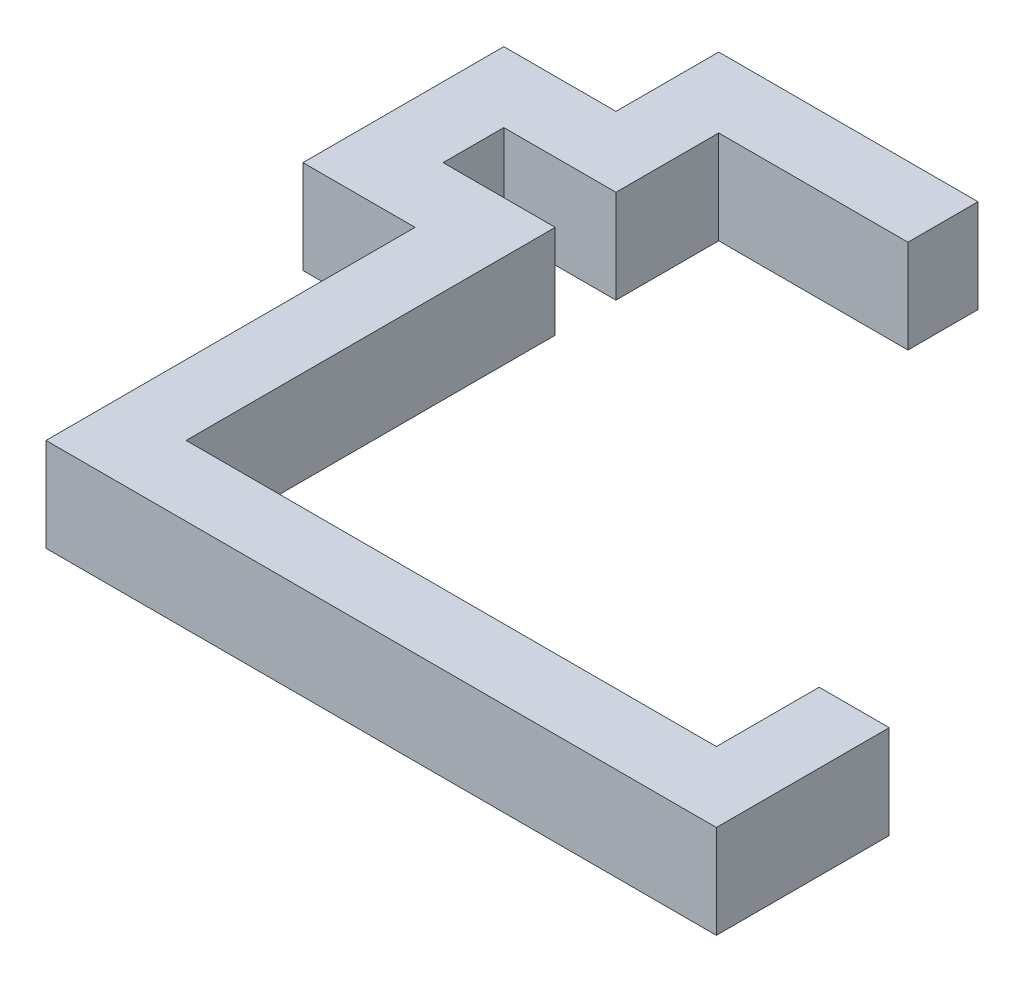
ISO-10303-21;
HEADER;
FILE_DESCRIPTION(('STEP AP214'),'2;1');
FILE_NAME('part.step','',(''),(''),'','','');
FILE_SCHEMA(('AUTOMOTIVE_DESIGN { 1 0 10303 214 1 1 1 1 }'));
ENDSEC;
DATA;
#1=APPLICATION_CONTEXT('core data for automotive mechanical design processes');
#2=APPLICATION_PROTOCOL_DEFINITION('international standard','automotive_design',2000,#1);
#3=PRODUCT_CONTEXT('',#1,'mechanical');
#4=PRODUCT('Part','Part','',(#3));
#5=PRODUCT_RELATED_PRODUCT_CATEGORY('part','',(#4));
#6=PRODUCT_DEFINITION_FORMATION('','',#4);
#7=PRODUCT_DEFINITION_CONTEXT('part definition',#1,'design');
#8=PRODUCT_DEFINITION('design','',#6,#7);
#9=PRODUCT_DEFINITION_SHAPE('','',#8);
#10=(LENGTH_UNIT() NAMED_UNIT(*) SI_UNIT(.MILLI.,.METRE.));
#11=(NAMED_UNIT(*) PLANE_ANGLE_UNIT() SI_UNIT($,.RADIAN.));
#12=(NAMED_UNIT(*) SI_UNIT($,.STERADIAN.) SOLID_ANGLE_UNIT());
#13=UNCERTAINTY_MEASURE_WITH_UNIT(LENGTH_MEASURE(1.E-05),#10,'distance_accuracy_value','');
#14=(GEOMETRIC_REPRESENTATION_CONTEXT(3) GLOBAL_UNCERTAINTY_ASSIGNED_CONTEXT((#13)) GLOBAL_UNIT_ASSIGNED_CONTEXT((#10,
#11,#12)) REPRESENTATION_CONTEXT('',''));
#15=CARTESIAN_POINT('',(0.,0.,0.));
#16=DIRECTION('',(0.,0.,1.));
#17=DIRECTION('',(1.,0.,0.));
#18=AXIS2_PLACEMENT_3D('',#15,#16,#17);
#19=CARTESIAN_POINT('',(0.,4.,-4.4));
#20=DIRECTION('',(1.,0.,0.));
#21=DIRECTION('',(0.,0.,-1.));
#22=AXIS2_PLACEMENT_3D('',#19,#20,#21);
#23=PLANE('',#22);
#24=DIRECTION('',(0.,0.,1.));
#25=VECTOR('',#24,1.);
#26=CARTESIAN_POINT('',(0.,0.,-4.4));
#27=LINE('',#26,#25);
#28=CARTESIAN_POINT('',(0.,0.,-4.4));
#29=VERTEX_POINT('',#28);
#30=CARTESIAN_POINT('',(0.,0.,0.));
#31=VERTEX_POINT('',#30);
#32=EDGE_CURVE('E355',#29,#31,#27,.T.);
#33=ORIENTED_EDGE('',*,*,#32,.T.);
#34=DIRECTION('',(0.,-1.,0.));
#35=VECTOR('',#34,1.);
#36=CARTESIAN_POINT('',(0.,4.,0.));
#37=LINE('',#36,#35);
#38=CARTESIAN_POINT('',(0.,4.,0.));
#39=VERTEX_POINT('',#38);
#40=EDGE_CURVE('E12',#39,#31,#37,.T.);
#41=ORIENTED_EDGE('',*,*,#40,.F.);
#42=DIRECTION('',(0.,0.,1.));
#43=VECTOR('',#42,1.);
#44=CARTESIAN_POINT('',(0.,4.,-4.4));
#45=LINE('',#44,#43);
#46=CARTESIAN_POINT('',(0.,4.,-4.4));
#47=VERTEX_POINT('',#46);
#48=EDGE_CURVE('E270',#47,#39,#45,.T.);
#49=ORIENTED_EDGE('',*,*,#48,.F.);
#50=DIRECTION('',(0.,-1.,0.));
#51=VECTOR('',#50,1.);
#52=CARTESIAN_POINT('',(0.,4.,-4.4));
#53=LINE('',#52,#51);
#54=EDGE_CURVE('E197',#47,#29,#53,.T.);
#55=ORIENTED_EDGE('',*,*,#54,.T.);
#56=EDGE_LOOP('',(#33,#41,#49,#55));
#57=FACE_BOUND('',#56,.T.);
#58=ADVANCED_FACE('F40',(#57),#23,.F.);
#59=CARTESIAN_POINT('',(0.,4.,0.));
#60=DIRECTION('',(0.,0.,1.));
#61=DIRECTION('',(1.,0.,0.));
#62=AXIS2_PLACEMENT_3D('',#59,#60,#61);
#63=PLANE('',#62);
#64=DIRECTION('',(-1.,0.,0.));
#65=VECTOR('',#64,1.);
#66=CARTESIAN_POINT('',(0.,0.,0.));
#67=LINE('',#66,#65);
#68=CARTESIAN_POINT('',(-22.7,0.,0.));
#69=VERTEX_POINT('',#68);
#70=EDGE_CURVE('E346',#31,#69,#67,.T.);
#71=ORIENTED_EDGE('',*,*,#70,.T.);
#72=DIRECTION('',(0.,-1.,0.));
#73=VECTOR('',#72,1.);
#74=CARTESIAN_POINT('',(-22.7,4.,0.));
#75=LINE('',#74,#73);
#76=CARTESIAN_POINT('',(-22.7,4.,0.));
#77=VERTEX_POINT('',#76);
#78=EDGE_CURVE('E49',#77,#69,#75,.T.);
#79=ORIENTED_EDGE('',*,*,#78,.F.);
#80=DIRECTION('',(-1.,0.,0.));
#81=VECTOR('',#80,1.);
#82=CARTESIAN_POINT('',(0.,4.,0.));
#83=LINE('',#82,#81);
#84=EDGE_CURVE('E130',#39,#77,#83,.T.);
#85=ORIENTED_EDGE('',*,*,#84,.F.);
#86=ORIENTED_EDGE('',*,*,#40,.T.);
#87=EDGE_LOOP('',(#71,#79,#85,#86));
#88=FACE_BOUND('',#87,.T.);
#89=ADVANCED_FACE('F409',(#88),#63,.F.);
#90=CARTESIAN_POINT('',(-22.7,4.,0.));
#91=DIRECTION('',(-1.,0.,0.));
#92=DIRECTION('',(0.,0.,1.));
#93=AXIS2_PLACEMENT_3D('',#90,#91,#92);
#94=PLANE('',#93);
#95=DIRECTION('',(0.,0.,-1.));
#96=VECTOR('',#95,1.);
#97=CARTESIAN_POINT('',(-22.7,0.,0.));
#98=LINE('',#97,#96);
#99=CARTESIAN_POINT('',(-22.7,0.,-15.8));
#100=VERTEX_POINT('',#99);
#101=EDGE_CURVE('E341',#69,#100,#98,.T.);
#102=ORIENTED_EDGE('',*,*,#101,.T.);
#103=DIRECTION('',(0.,-1.,0.));
#104=VECTOR('',#103,1.);
#105=CARTESIAN_POINT('',(-22.7,4.,-15.8));
#106=LINE('',#105,#104);
#107=CARTESIAN_POINT('',(-22.7,4.,-15.8));
#108=VERTEX_POINT('',#107);
#109=EDGE_CURVE('E331',#108,#100,#106,.T.);
#110=ORIENTED_EDGE('',*,*,#109,.F.);
#111=DIRECTION('',(0.,0.,-1.));
#112=VECTOR('',#111,1.);
#113=CARTESIAN_POINT('',(-22.7,4.,0.));
#114=LINE('',#113,#112);
#115=EDGE_CURVE('E264',#77,#108,#114,.T.);
#116=ORIENTED_EDGE('',*,*,#115,.F.);
#117=ORIENTED_EDGE('',*,*,#78,.T.);
#118=EDGE_LOOP('',(#102,#110,#116,#117));
#119=FACE_BOUND('',#118,.T.);
#120=ADVANCED_FACE('F339',(#119),#94,.F.);
#121=CARTESIAN_POINT('',(-22.7,4.,-15.8));
#122=DIRECTION('',(0.,0.,1.));
#123=DIRECTION('',(1.,0.,0.));
#124=AXIS2_PLACEMENT_3D('',#121,#122,#123);
#125=PLANE('',#124);
#126=DIRECTION('',(-1.,0.,0.));
#127=VECTOR('',#126,1.);
#128=CARTESIAN_POINT('',(-22.7,0.,-15.8));
#129=LINE('',#128,#127);
#130=CARTESIAN_POINT('',(-27.5,0.,-15.8));
#131=VERTEX_POINT('',#130);
#132=EDGE_CURVE('E348',#100,#131,#129,.T.);
#133=ORIENTED_EDGE('',*,*,#132,.T.);
#134=DIRECTION('',(0.,-1.,0.));
#135=VECTOR('',#134,1.);
#136=CARTESIAN_POINT('',(-27.5,4.,-15.8));
#137=LINE('',#136,#135);
#138=CARTESIAN_POINT('',(-27.5,4.,-15.8));
#139=VERTEX_POINT('',#138);
#140=EDGE_CURVE('E327',#139,#131,#137,.T.);
#141=ORIENTED_EDGE('',*,*,#140,.F.);
#142=DIRECTION('',(-1.,0.,0.));
#143=VECTOR('',#142,1.);
#144=CARTESIAN_POINT('',(-22.7,4.,-15.8));
#145=LINE('',#144,#143);
#146=EDGE_CURVE('E256',#108,#139,#145,.T.);
#147=ORIENTED_EDGE('',*,*,#146,.F.);
#148=ORIENTED_EDGE('',*,*,#109,.T.);
#149=EDGE_LOOP('',(#133,#141,#147,#148));
#150=FACE_BOUND('',#149,.T.);
#151=ADVANCED_FACE('F416',(#150),#125,.F.);
#152=CARTESIAN_POINT('',(-27.5,4.,-15.8));
#153=DIRECTION('',(-1.,0.,0.));
#154=DIRECTION('',(0.,0.,1.));
#155=AXIS2_PLACEMENT_3D('',#152,#153,#154);
#156=PLANE('',#155);
#157=DIRECTION('',(0.,0.,-1.));
#158=VECTOR('',#157,1.);
#159=CARTESIAN_POINT('',(-27.5,0.,-15.8));
#160=LINE('',#159,#158);
#161=CARTESIAN_POINT('',(-27.5,0.,-18.4));
#162=VERTEX_POINT('',#161);
#163=EDGE_CURVE('E353',#131,#162,#160,.T.);
#164=ORIENTED_EDGE('',*,*,#163,.T.);
#165=DIRECTION('',(0.,-1.,0.));
#166=VECTOR('',#165,1.);
#167=CARTESIAN_POINT('',(-27.5,4.,-18.4));
#168=LINE('',#167,#166);
#169=CARTESIAN_POINT('',(-27.5,4.,-18.4));
#170=VERTEX_POINT('',#169);
#171=EDGE_CURVE('E323',#170,#162,#168,.T.);
#172=ORIENTED_EDGE('',*,*,#171,.F.);
#173=DIRECTION('',(0.,0.,-1.));
#174=VECTOR('',#173,1.);
#175=CARTESIAN_POINT('',(-27.5,4.,-15.8));
#176=LINE('',#175,#174);
#177=EDGE_CURVE('E252',#139,#170,#176,.T.);
#178=ORIENTED_EDGE('',*,*,#177,.F.);
#179=ORIENTED_EDGE('',*,*,#140,.T.);
#180=EDGE_LOOP('',(#164,#172,#178,#179));
#181=FACE_BOUND('',#180,.T.);
#182=ADVANCED_FACE('F421',(#181),#156,.F.);
#183=CARTESIAN_POINT('',(-27.5,4.,-18.4));
#184=DIRECTION('',(0.,0.,-1.));
#185=DIRECTION('',(-1.,0.,0.));
#186=AXIS2_PLACEMENT_3D('',#183,#184,#185);
#187=PLANE('',#186);
#188=DIRECTION('',(1.,0.,0.));
#189=VECTOR('',#188,1.);
#190=CARTESIAN_POINT('',(-27.5,0.,-18.4));
#191=LINE('',#190,#189);
#192=CARTESIAN_POINT('',(-22.7,0.,-18.4));
#193=VERTEX_POINT('',#192);
#194=EDGE_CURVE('E360',#162,#193,#191,.T.);
#195=ORIENTED_EDGE('',*,*,#194,.T.);
#196=DIRECTION('',(0.,-1.,0.));
#197=VECTOR('',#196,1.);
#198=CARTESIAN_POINT('',(-22.7,4.,-18.4));
#199=LINE('',#198,#197);
#200=CARTESIAN_POINT('',(-22.7,4.,-18.4));
#201=VERTEX_POINT('',#200);
#202=EDGE_CURVE('E319',#201,#193,#199,.T.);
#203=ORIENTED_EDGE('',*,*,#202,.F.);
#204=DIRECTION('',(1.,0.,0.));
#205=VECTOR('',#204,1.);
#206=CARTESIAN_POINT('',(-27.5,4.,-18.4));
#207=LINE('',#206,#205);
#208=EDGE_CURVE('E248',#170,#201,#207,.T.);
#209=ORIENTED_EDGE('',*,*,#208,.F.);
#210=ORIENTED_EDGE('',*,*,#171,.T.);
#211=EDGE_LOOP('',(#195,#203,#209,#210));
#212=FACE_BOUND('',#211,.T.);
#213=ADVANCED_FACE('F425',(#212),#187,.F.);
#214=CARTESIAN_POINT('',(-22.7,4.,-18.4));
#215=DIRECTION('',(-1.,0.,0.));
#216=DIRECTION('',(0.,0.,1.));
#217=AXIS2_PLACEMENT_3D('',#214,#215,#216);
#218=PLANE('',#217);
#219=DIRECTION('',(0.,0.,-1.));
#220=VECTOR('',#219,1.);
#221=CARTESIAN_POINT('',(-22.7,0.,-18.4));
#222=LINE('',#221,#220);
#223=CARTESIAN_POINT('',(-22.7,0.,-22.8));
#224=VERTEX_POINT('',#223);
#225=EDGE_CURVE('E363',#193,#224,#222,.T.);
#226=ORIENTED_EDGE('',*,*,#225,.T.);
#227=DIRECTION('',(0.,-1.,0.));
#228=VECTOR('',#227,1.);
#229=CARTESIAN_POINT('',(-22.7,4.,-22.8));
#230=LINE('',#229,#228);
#231=CARTESIAN_POINT('',(-22.7,4.,-22.8));
#232=VERTEX_POINT('',#231);
#233=EDGE_CURVE('E315',#232,#224,#230,.T.);
#234=ORIENTED_EDGE('',*,*,#233,.F.);
#235=DIRECTION('',(0.,0.,-1.));
#236=VECTOR('',#235,1.);
#237=CARTESIAN_POINT('',(-22.7,4.,-18.4));
#238=LINE('',#237,#236);
#239=EDGE_CURVE('E245',#201,#232,#238,.T.);
#240=ORIENTED_EDGE('',*,*,#239,.F.);
#241=ORIENTED_EDGE('',*,*,#202,.T.);
#242=EDGE_LOOP('',(#226,#234,#240,#241));
#243=FACE_BOUND('',#242,.T.);
#244=ADVANCED_FACE('F429',(#243),#218,.F.);
#245=CARTESIAN_POINT('',(-22.7,4.,-22.8));
#246=DIRECTION('',(0.,0.,-1.));
#247=DIRECTION('',(-1.,0.,0.));
#248=AXIS2_PLACEMENT_3D('',#245,#246,#247);
#249=PLANE('',#248);
#250=DIRECTION('',(1.,0.,0.));
#251=VECTOR('',#250,1.);
#252=CARTESIAN_POINT('',(-22.7,0.,-22.8));
#253=LINE('',#252,#251);
#254=CARTESIAN_POINT('',(-14.6,0.,-22.8));
#255=VERTEX_POINT('',#254);
#256=EDGE_CURVE('E366',#224,#255,#253,.T.);
#257=ORIENTED_EDGE('',*,*,#256,.T.);
#258=DIRECTION('',(0.,-1.,0.));
#259=VECTOR('',#258,1.);
#260=CARTESIAN_POINT('',(-14.6,4.,-22.8));
#261=LINE('',#260,#259);
#262=CARTESIAN_POINT('',(-14.6,4.,-22.8));
#263=VERTEX_POINT('',#262);
#264=EDGE_CURVE('E311',#263,#255,#261,.T.);
#265=ORIENTED_EDGE('',*,*,#264,.F.);
#266=DIRECTION('',(1.,0.,0.));
#267=VECTOR('',#266,1.);
#268=CARTESIAN_POINT('',(-22.7,4.,-22.8));
#269=LINE('',#268,#267);
#270=EDGE_CURVE('E237',#232,#263,#269,.T.);
#271=ORIENTED_EDGE('',*,*,#270,.F.);
#272=ORIENTED_EDGE('',*,*,#233,.T.);
#273=EDGE_LOOP('',(#257,#265,#271,#272));
#274=FACE_BOUND('',#273,.T.);
#275=ADVANCED_FACE('F433',(#274),#249,.F.);
#276=CARTESIAN_POINT('',(-14.6,4.,-22.8));
#277=DIRECTION('',(-1.,0.,0.));
#278=DIRECTION('',(0.,0.,1.));
#279=AXIS2_PLACEMENT_3D('',#276,#277,#278);
#280=PLANE('',#279);
#281=DIRECTION('',(0.,0.,-1.));
#282=VECTOR('',#281,1.);
#283=CARTESIAN_POINT('',(-14.6,0.,-22.8));
#284=LINE('',#283,#282);
#285=CARTESIAN_POINT('',(-14.6,0.,-25.8));
#286=VERTEX_POINT('',#285);
#287=EDGE_CURVE('E369',#255,#286,#284,.T.);
#288=ORIENTED_EDGE('',*,*,#287,.T.);
#289=DIRECTION('',(0.,-1.,0.));
#290=VECTOR('',#289,1.);
#291=CARTESIAN_POINT('',(-14.6,4.,-25.8));
#292=LINE('',#291,#290);
#293=CARTESIAN_POINT('',(-14.6,4.,-25.8));
#294=VERTEX_POINT('',#293);
#295=EDGE_CURVE('E307',#294,#286,#292,.T.);
#296=ORIENTED_EDGE('',*,*,#295,.F.);
#297=DIRECTION('',(0.,0.,-1.));
#298=VECTOR('',#297,1.);
#299=CARTESIAN_POINT('',(-14.6,4.,-22.8));
#300=LINE('',#299,#298);
#301=EDGE_CURVE('E233',#263,#294,#300,.T.);
#302=ORIENTED_EDGE('',*,*,#301,.F.);
#303=ORIENTED_EDGE('',*,*,#264,.T.);
#304=EDGE_LOOP('',(#288,#296,#302,#303));
#305=FACE_BOUND('',#304,.T.);
#306=ADVANCED_FACE('F437',(#305),#280,.F.);
#307=CARTESIAN_POINT('',(-14.6,4.,-25.8));
#308=DIRECTION('',(0.,0.,1.));
#309=DIRECTION('',(1.,0.,0.));
#310=AXIS2_PLACEMENT_3D('',#307,#308,#309);
#311=PLANE('',#310);
#312=DIRECTION('',(-1.,0.,0.));
#313=VECTOR('',#312,1.);
#314=CARTESIAN_POINT('',(-14.6,0.,-25.8));
#315=LINE('',#314,#313);
#316=CARTESIAN_POINT('',(-25.7,0.,-25.8));
#317=VERTEX_POINT('',#316);
#318=EDGE_CURVE('E372',#286,#317,#315,.T.);
#319=ORIENTED_EDGE('',*,*,#318,.T.);
#320=DIRECTION('',(0.,-1.,0.));
#321=VECTOR('',#320,1.);
#322=CARTESIAN_POINT('',(-25.7,4.,-25.8));
#323=LINE('',#322,#321);
#324=CARTESIAN_POINT('',(-25.7,4.,-25.8));
#325=VERTEX_POINT('',#324);
#326=EDGE_CURVE('E303',#325,#317,#323,.T.);
#327=ORIENTED_EDGE('',*,*,#326,.F.);
#328=DIRECTION('',(-1.,0.,0.));
#329=VECTOR('',#328,1.);
#330=CARTESIAN_POINT('',(-14.6,4.,-25.8));
#331=LINE('',#330,#329);
#332=EDGE_CURVE('E229',#294,#325,#331,.T.);
#333=ORIENTED_EDGE('',*,*,#332,.F.);
#334=ORIENTED_EDGE('',*,*,#295,.T.);
#335=EDGE_LOOP('',(#319,#327,#333,#334));
#336=FACE_BOUND('',#335,.T.);
#337=ADVANCED_FACE('F441',(#336),#311,.F.);
#338=CARTESIAN_POINT('',(-25.7,4.,-25.8));
#339=DIRECTION('',(1.,0.,0.));
#340=DIRECTION('',(0.,0.,-1.));
#341=AXIS2_PLACEMENT_3D('',#338,#339,#340);
#342=PLANE('',#341);
#343=DIRECTION('',(0.,0.,1.));
#344=VECTOR('',#343,1.);
#345=CARTESIAN_POINT('',(-25.7,0.,-25.8));
#346=LINE('',#345,#344);
#347=CARTESIAN_POINT('',(-25.7,0.,-21.4));
#348=VERTEX_POINT('',#347);
#349=EDGE_CURVE('E375',#317,#348,#346,.T.);
#350=ORIENTED_EDGE('',*,*,#349,.T.);
#351=DIRECTION('',(0.,-1.,0.));
#352=VECTOR('',#351,1.);
#353=CARTESIAN_POINT('',(-25.7,4.,-21.4));
#354=LINE('',#353,#352);
#355=CARTESIAN_POINT('',(-25.7,4.,-21.4));
#356=VERTEX_POINT('',#355);
#357=EDGE_CURVE('E299',#356,#348,#354,.T.);
#358=ORIENTED_EDGE('',*,*,#357,.F.);
#359=DIRECTION('',(0.,0.,1.));
#360=VECTOR('',#359,1.);
#361=CARTESIAN_POINT('',(-25.7,4.,-25.8));
#362=LINE('',#361,#360);
#363=EDGE_CURVE('E226',#325,#356,#362,.T.);
#364=ORIENTED_EDGE('',*,*,#363,.F.);
#365=ORIENTED_EDGE('',*,*,#326,.T.);
#366=EDGE_LOOP('',(#350,#358,#364,#365));
#367=FACE_BOUND('',#366,.T.);
#368=ADVANCED_FACE('F445',(#367),#342,.F.);
#369=CARTESIAN_POINT('',(-25.7,4.,-21.4));
#370=DIRECTION('',(0.,0.,1.));
#371=DIRECTION('',(1.,0.,0.));
#372=AXIS2_PLACEMENT_3D('',#369,#370,#371);
#373=PLANE('',#372);
#374=DIRECTION('',(-1.,0.,0.));
#375=VECTOR('',#374,1.);
#376=CARTESIAN_POINT('',(-25.7,0.,-21.4));
#377=LINE('',#376,#375);
#378=CARTESIAN_POINT('',(-30.5,0.,-21.4));
#379=VERTEX_POINT('',#378);
#380=EDGE_CURVE('E378',#348,#379,#377,.T.);
#381=ORIENTED_EDGE('',*,*,#380,.T.);
#382=DIRECTION('',(0.,-1.,0.));
#383=VECTOR('',#382,1.);
#384=CARTESIAN_POINT('',(-30.5,4.,-21.4));
#385=LINE('',#384,#383);
#386=CARTESIAN_POINT('',(-30.5,4.,-21.4));
#387=VERTEX_POINT('',#386);
#388=EDGE_CURVE('E295',#387,#379,#385,.T.);
#389=ORIENTED_EDGE('',*,*,#388,.F.);
#390=DIRECTION('',(-1.,0.,0.));
#391=VECTOR('',#390,1.);
#392=CARTESIAN_POINT('',(-25.7,4.,-21.4));
#393=LINE('',#392,#391);
#394=EDGE_CURVE('E218',#356,#387,#393,.T.);
#395=ORIENTED_EDGE('',*,*,#394,.F.);
#396=ORIENTED_EDGE('',*,*,#357,.T.);
#397=EDGE_LOOP('',(#381,#389,#395,#396));
#398=FACE_BOUND('',#397,.T.);
#399=ADVANCED_FACE('F449',(#398),#373,.F.);
#400=CARTESIAN_POINT('',(-30.5,4.,-21.4));
#401=DIRECTION('',(1.,0.,0.));
#402=DIRECTION('',(0.,0.,-1.));
#403=AXIS2_PLACEMENT_3D('',#400,#401,#402);
#404=PLANE('',#403);
#405=DIRECTION('',(0.,0.,1.));
#406=VECTOR('',#405,1.);
#407=CARTESIAN_POINT('',(-30.5,0.,-21.4));
#408=LINE('',#407,#406);
#409=CARTESIAN_POINT('',(-30.5,0.,-12.8));
#410=VERTEX_POINT('',#409);
#411=EDGE_CURVE('E381',#379,#410,#408,.T.);
#412=ORIENTED_EDGE('',*,*,#411,.T.);
#413=DIRECTION('',(0.,-1.,0.));
#414=VECTOR('',#413,1.);
#415=CARTESIAN_POINT('',(-30.5,4.,-12.8));
#416=LINE('',#415,#414);
#417=CARTESIAN_POINT('',(-30.5,4.,-12.8));
#418=VERTEX_POINT('',#417);
#419=EDGE_CURVE('E291',#418,#410,#416,.T.);
#420=ORIENTED_EDGE('',*,*,#419,.F.);
#421=DIRECTION('',(0.,0.,1.));
#422=VECTOR('',#421,1.);
#423=CARTESIAN_POINT('',(-30.5,4.,-21.4));
#424=LINE('',#423,#422);
#425=EDGE_CURVE('E214',#387,#418,#424,.T.);
#426=ORIENTED_EDGE('',*,*,#425,.F.);
#427=ORIENTED_EDGE('',*,*,#388,.T.);
#428=EDGE_LOOP('',(#412,#420,#426,#427));
#429=FACE_BOUND('',#428,.T.);
#430=ADVANCED_FACE('F453',(#429),#404,.F.);
#431=CARTESIAN_POINT('',(-30.5,4.,-12.8));
#432=DIRECTION('',(0.,0.,-1.));
#433=DIRECTION('',(-1.,0.,0.));
#434=AXIS2_PLACEMENT_3D('',#431,#432,#433);
#435=PLANE('',#434);
#436=DIRECTION('',(1.,0.,0.));
#437=VECTOR('',#436,1.);
#438=CARTESIAN_POINT('',(-30.5,0.,-12.8));
#439=LINE('',#438,#437);
#440=CARTESIAN_POINT('',(-25.7,0.,-12.8));
#441=VERTEX_POINT('',#440);
#442=EDGE_CURVE('E384',#410,#441,#439,.T.);
#443=ORIENTED_EDGE('',*,*,#442,.T.);
#444=DIRECTION('',(0.,-1.,0.));
#445=VECTOR('',#444,1.);
#446=CARTESIAN_POINT('',(-25.7,4.,-12.8));
#447=LINE('',#446,#445);
#448=CARTESIAN_POINT('',(-25.7,4.,-12.8));
#449=VERTEX_POINT('',#448);
#450=EDGE_CURVE('E287',#449,#441,#447,.T.);
#451=ORIENTED_EDGE('',*,*,#450,.F.);
#452=DIRECTION('',(1.,0.,0.));
#453=VECTOR('',#452,1.);
#454=CARTESIAN_POINT('',(-30.5,4.,-12.8));
#455=LINE('',#454,#453);
#456=EDGE_CURVE('E210',#418,#449,#455,.T.);
#457=ORIENTED_EDGE('',*,*,#456,.F.);
#458=ORIENTED_EDGE('',*,*,#419,.T.);
#459=EDGE_LOOP('',(#443,#451,#457,#458));
#460=FACE_BOUND('',#459,.T.);
#461=ADVANCED_FACE('F457',(#460),#435,.F.);
#462=CARTESIAN_POINT('',(-25.7,4.,-12.8));
#463=DIRECTION('',(1.,0.,0.));
#464=DIRECTION('',(0.,0.,-1.));
#465=AXIS2_PLACEMENT_3D('',#462,#463,#464);
#466=PLANE('',#465);
#467=DIRECTION('',(0.,0.,1.));
#468=VECTOR('',#467,1.);
#469=CARTESIAN_POINT('',(-25.7,0.,-12.8));
#470=LINE('',#469,#468);
#471=CARTESIAN_POINT('',(-25.7,0.,3.));
#472=VERTEX_POINT('',#471);
#473=EDGE_CURVE('E387',#441,#472,#470,.T.);
#474=ORIENTED_EDGE('',*,*,#473,.T.);
#475=DIRECTION('',(0.,-1.,0.));
#476=VECTOR('',#475,1.);
#477=CARTESIAN_POINT('',(-25.7,4.,3.));
#478=LINE('',#477,#476);
#479=CARTESIAN_POINT('',(-25.7,4.,3.));
#480=VERTEX_POINT('',#479);
#481=EDGE_CURVE('E190',#480,#472,#478,.T.);
#482=ORIENTED_EDGE('',*,*,#481,.F.);
#483=DIRECTION('',(0.,0.,1.));
#484=VECTOR('',#483,1.);
#485=CARTESIAN_POINT('',(-25.7,4.,-12.8));
#486=LINE('',#485,#484);
#487=EDGE_CURVE('E179',#449,#480,#486,.T.);
#488=ORIENTED_EDGE('',*,*,#487,.F.);
#489=ORIENTED_EDGE('',*,*,#450,.T.);
#490=EDGE_LOOP('',(#474,#482,#488,#489));
#491=FACE_BOUND('',#490,.T.);
#492=ADVANCED_FACE('F392',(#491),#466,.F.);
#493=CARTESIAN_POINT('',(-25.7,4.,3.));
#494=DIRECTION('',(0.,0.,-1.));
#495=DIRECTION('',(-1.,0.,0.));
#496=AXIS2_PLACEMENT_3D('',#493,#494,#495);
#497=PLANE('',#496);
#498=DIRECTION('',(1.,0.,0.));
#499=VECTOR('',#498,1.);
#500=CARTESIAN_POINT('',(-25.7,0.,3.));
#501=LINE('',#500,#499);
#502=CARTESIAN_POINT('',(3.,0.,3.));
#503=VERTEX_POINT('',#502);
#504=EDGE_CURVE('E188',#472,#503,#501,.T.);
#505=ORIENTED_EDGE('',*,*,#504,.T.);
#506=DIRECTION('',(0.,-1.,0.));
#507=VECTOR('',#506,1.);
#508=CARTESIAN_POINT('',(3.,4.,3.));
#509=LINE('',#508,#507);
#510=CARTESIAN_POINT('',(3.,4.,3.));
#511=VERTEX_POINT('',#510);
#512=EDGE_CURVE('E185',#511,#503,#509,.T.);
#513=ORIENTED_EDGE('',*,*,#512,.F.);
#514=DIRECTION('',(1.,0.,0.));
#515=VECTOR('',#514,1.);
#516=CARTESIAN_POINT('',(-25.7,4.,3.));
#517=LINE('',#516,#515);
#518=EDGE_CURVE('E173',#480,#511,#517,.T.);
#519=ORIENTED_EDGE('',*,*,#518,.F.);
#520=ORIENTED_EDGE('',*,*,#481,.T.);
#521=EDGE_LOOP('',(#505,#513,#519,#520));
#522=FACE_BOUND('',#521,.T.);
#523=ADVANCED_FACE('F186',(#522),#497,.F.);
#524=CARTESIAN_POINT('',(3.,4.,3.));
#525=DIRECTION('',(-1.,0.,0.));
#526=DIRECTION('',(0.,0.,1.));
#527=AXIS2_PLACEMENT_3D('',#524,#525,#526);
#528=PLANE('',#527);
#529=DIRECTION('',(0.,0.,-1.));
#530=VECTOR('',#529,1.);
#531=CARTESIAN_POINT('',(3.,0.,3.));
#532=LINE('',#531,#530);
#533=CARTESIAN_POINT('',(3.,0.,-4.4));
#534=VERTEX_POINT('',#533);
#535=EDGE_CURVE('E116',#503,#534,#532,.T.);
#536=ORIENTED_EDGE('',*,*,#535,.T.);
#537=DIRECTION('',(0.,-1.,0.));
#538=VECTOR('',#537,1.);
#539=CARTESIAN_POINT('',(3.,4.,-4.4));
#540=LINE('',#539,#538);
#541=CARTESIAN_POINT('',(3.,4.,-4.4));
#542=VERTEX_POINT('',#541);
#543=EDGE_CURVE('E191',#542,#534,#540,.T.);
#544=ORIENTED_EDGE('',*,*,#543,.F.);
#545=DIRECTION('',(0.,0.,-1.));
#546=VECTOR('',#545,1.);
#547=CARTESIAN_POINT('',(3.,4.,3.));
#548=LINE('',#547,#546);
#549=EDGE_CURVE('E177',#511,#542,#548,.T.);
#550=ORIENTED_EDGE('',*,*,#549,.F.);
#551=ORIENTED_EDGE('',*,*,#512,.T.);
#552=EDGE_LOOP('',(#536,#544,#550,#551));
#553=FACE_BOUND('',#552,.T.);
#554=ADVANCED_FACE('F193',(#553),#528,.F.);
#555=CARTESIAN_POINT('',(3.,4.,-4.4));
#556=DIRECTION('',(0.,0.,1.));
#557=DIRECTION('',(1.,0.,0.));
#558=AXIS2_PLACEMENT_3D('',#555,#556,#557);
#559=PLANE('',#558);
#560=DIRECTION('',(-1.,0.,0.));
#561=VECTOR('',#560,1.);
#562=CARTESIAN_POINT('',(3.,0.,-4.4));
#563=LINE('',#562,#561);
#564=EDGE_CURVE('E122',#534,#29,#563,.T.);
#565=ORIENTED_EDGE('',*,*,#564,.T.);
#566=ORIENTED_EDGE('',*,*,#54,.F.);
#567=DIRECTION('',(-1.,0.,0.));
#568=VECTOR('',#567,1.);
#569=CARTESIAN_POINT('',(3.,4.,-4.4));
#570=LINE('',#569,#568);
#571=EDGE_CURVE('E57',#542,#47,#570,.T.);
#572=ORIENTED_EDGE('',*,*,#571,.F.);
#573=ORIENTED_EDGE('',*,*,#543,.T.);
#574=EDGE_LOOP('',(#565,#566,#572,#573));
#575=FACE_BOUND('',#574,.T.);
#576=ADVANCED_FACE('F398',(#575),#559,.F.);
#577=CARTESIAN_POINT('',(0.,4.,0.));
#578=DIRECTION('',(0.,-1.,0.));
#579=DIRECTION('',(0.,0.,-1.));
#580=AXIS2_PLACEMENT_3D('',#577,#578,#579);
#581=PLANE('',#580);
#582=ORIENTED_EDGE('',*,*,#48,.T.);
#583=ORIENTED_EDGE('',*,*,#84,.T.);
#584=ORIENTED_EDGE('',*,*,#115,.T.);
#585=ORIENTED_EDGE('',*,*,#146,.T.);
#586=ORIENTED_EDGE('',*,*,#177,.T.);
#587=ORIENTED_EDGE('',*,*,#208,.T.);
#588=ORIENTED_EDGE('',*,*,#239,.T.);
#589=ORIENTED_EDGE('',*,*,#270,.T.);
#590=ORIENTED_EDGE('',*,*,#301,.T.);
#591=ORIENTED_EDGE('',*,*,#332,.T.);
#592=ORIENTED_EDGE('',*,*,#363,.T.);
#593=ORIENTED_EDGE('',*,*,#394,.T.);
#594=ORIENTED_EDGE('',*,*,#425,.T.);
#595=ORIENTED_EDGE('',*,*,#456,.T.);
#596=ORIENTED_EDGE('',*,*,#487,.T.);
#597=ORIENTED_EDGE('',*,*,#518,.T.);
#598=ORIENTED_EDGE('',*,*,#549,.T.);
#599=ORIENTED_EDGE('',*,*,#571,.T.);
#600=EDGE_LOOP('',(#582,#583,#584,#585,#586,#587,#588,#589,#590,#591,#592,#593,#594,#595,#596,
#597,#598,#599));
#601=FACE_BOUND('',#600,.T.);
#602=ADVANCED_FACE('F175',(#601),#581,.F.);
#603=CARTESIAN_POINT('',(0.,0.,0.));
#604=DIRECTION('',(0.,-1.,0.));
#605=DIRECTION('',(0.,0.,-1.));
#606=AXIS2_PLACEMENT_3D('',#603,#604,#605);
#607=PLANE('',#606);
#608=ORIENTED_EDGE('',*,*,#32,.F.);
#609=ORIENTED_EDGE('',*,*,#564,.F.);
#610=ORIENTED_EDGE('',*,*,#535,.F.);
#611=ORIENTED_EDGE('',*,*,#504,.F.);
#612=ORIENTED_EDGE('',*,*,#473,.F.);
#613=ORIENTED_EDGE('',*,*,#442,.F.);
#614=ORIENTED_EDGE('',*,*,#411,.F.);
#615=ORIENTED_EDGE('',*,*,#380,.F.);
#616=ORIENTED_EDGE('',*,*,#349,.F.);
#617=ORIENTED_EDGE('',*,*,#318,.F.);
#618=ORIENTED_EDGE('',*,*,#287,.F.);
#619=ORIENTED_EDGE('',*,*,#256,.F.);
#620=ORIENTED_EDGE('',*,*,#225,.F.);
#621=ORIENTED_EDGE('',*,*,#194,.F.);
#622=ORIENTED_EDGE('',*,*,#163,.F.);
#623=ORIENTED_EDGE('',*,*,#132,.F.);
#624=ORIENTED_EDGE('',*,*,#101,.F.);
#625=ORIENTED_EDGE('',*,*,#70,.F.);
#626=EDGE_LOOP('',(#608,#609,#610,#611,#612,#613,#614,#615,#616,#617,#618,#619,#620,#621,#622,
#623,#624,#625));
#627=FACE_BOUND('',#626,.T.);
#628=ADVANCED_FACE('F345',(#627),#607,.T.);
#629=CLOSED_SHELL('',(#58,#89,#120,#151,#182,#213,#244,#275,#306,#337,#368,#399,#430,#461,#492,
#523,#554,#576,#602,#628));
#630=MANIFOLD_SOLID_BREP('B2',#629);
#631=ADVANCED_BREP_SHAPE_REPRESENTATION('',(#18,#630),#14);
#632=SHAPE_DEFINITION_REPRESENTATION(#9,#631);
ENDSEC;
END-ISO-10303-21;
